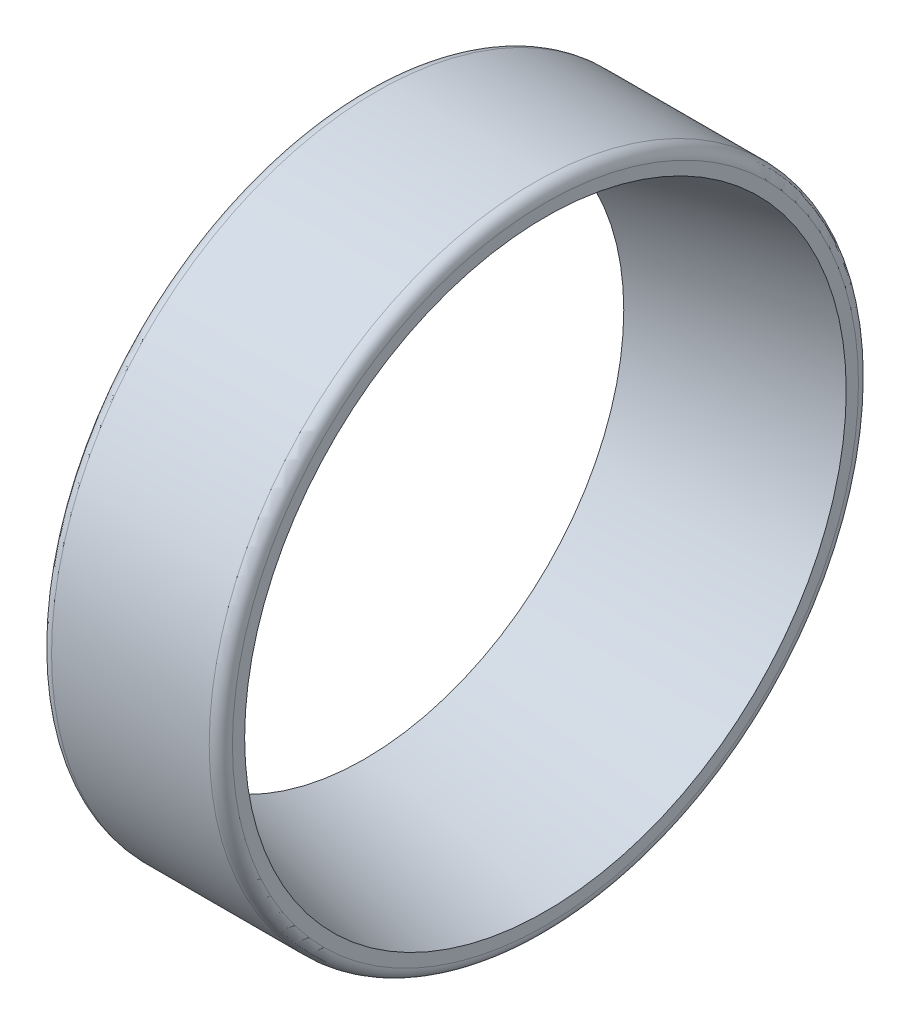
ISO-10303-21;
HEADER;
FILE_DESCRIPTION(('STEP AP214'),'2;1');
FILE_NAME('part.step','',(''),(''),'','','');
FILE_SCHEMA(('AUTOMOTIVE_DESIGN { 1 0 10303 214 1 1 1 1 }'));
ENDSEC;
DATA;
#1=APPLICATION_CONTEXT('core data for automotive mechanical design processes');
#2=APPLICATION_PROTOCOL_DEFINITION('international standard','automotive_design',2000,#1);
#3=PRODUCT_CONTEXT('',#1,'mechanical');
#4=PRODUCT('Part','Part','',(#3));
#5=PRODUCT_RELATED_PRODUCT_CATEGORY('part','',(#4));
#6=PRODUCT_DEFINITION_FORMATION('','',#4);
#7=PRODUCT_DEFINITION_CONTEXT('part definition',#1,'design');
#8=PRODUCT_DEFINITION('design','',#6,#7);
#9=PRODUCT_DEFINITION_SHAPE('','',#8);
#10=(LENGTH_UNIT() NAMED_UNIT(*) SI_UNIT(.MILLI.,.METRE.));
#11=(NAMED_UNIT(*) PLANE_ANGLE_UNIT() SI_UNIT($,.RADIAN.));
#12=(NAMED_UNIT(*) SI_UNIT($,.STERADIAN.) SOLID_ANGLE_UNIT());
#13=UNCERTAINTY_MEASURE_WITH_UNIT(LENGTH_MEASURE(1.E-05),#10,'distance_accuracy_value','');
#14=(GEOMETRIC_REPRESENTATION_CONTEXT(3) GLOBAL_UNCERTAINTY_ASSIGNED_CONTEXT((#13)) GLOBAL_UNIT_ASSIGNED_CONTEXT((#10,
#11,#12)) REPRESENTATION_CONTEXT('',''));
#15=CARTESIAN_POINT('',(0.,0.,0.));
#16=DIRECTION('',(0.,0.,1.));
#17=DIRECTION('',(1.,0.,0.));
#18=AXIS2_PLACEMENT_3D('',#15,#16,#17);
#19=CARTESIAN_POINT('',(-48.4999999999988,0.,0.));
#20=DIRECTION('',(1.,0.,0.));
#21=DIRECTION('',(0.,0.,-1.));
#22=AXIS2_PLACEMENT_3D('',#19,#20,#21);
#23=TOROIDAL_SURFACE('',#22,67.4999999999987,2.50000000000127);
#24=CARTESIAN_POINT('',(-51.,0.,0.));
#25=DIRECTION('',(1.,0.,0.));
#26=DIRECTION('',(0.,0.,-1.));
#27=AXIS2_PLACEMENT_3D('',#24,#25,#26);
#28=CIRCLE('',#27,67.500000567418);
#29=CARTESIAN_POINT('',(-51.,0.,-67.500000567418));
#30=VERTEX_POINT('',#29);
#31=EDGE_CURVE('E38',#30,#30,#28,.T.);
#32=ORIENTED_EDGE('',*,*,#31,.T.);
#33=EDGE_LOOP('',(#32));
#34=FACE_BOUND('',#33,.T.);
#35=CARTESIAN_POINT('',(-48.5,0.,0.));
#36=DIRECTION('',(1.,0.,0.));
#37=DIRECTION('',(0.,0.,-1.));
#38=AXIS2_PLACEMENT_3D('',#35,#36,#37);
#39=CIRCLE('',#38,70.);
#40=CARTESIAN_POINT('',(-48.5,0.,-70.));
#41=VERTEX_POINT('',#40);
#42=EDGE_CURVE('E35',#41,#41,#39,.T.);
#43=ORIENTED_EDGE('',*,*,#42,.F.);
#44=EDGE_LOOP('',(#43));
#45=FACE_BOUND('',#44,.T.);
#46=ADVANCED_FACE('F15',(#34,#45),#23,.T.);
#47=CARTESIAN_POINT('',(-51.,67.5,0.));
#48=DIRECTION('',(-1.,0.,0.));
#49=DIRECTION('',(0.,0.,1.));
#50=AXIS2_PLACEMENT_3D('',#47,#48,#49);
#51=PLANE('',#50);
#52=CARTESIAN_POINT('',(-51.,0.,0.));
#53=DIRECTION('',(1.,0.,0.));
#54=DIRECTION('',(0.,0.,-1.));
#55=AXIS2_PLACEMENT_3D('',#52,#53,#54);
#56=CIRCLE('',#55,55.893);
#57=CARTESIAN_POINT('',(-51.,0.,-55.893));
#58=VERTEX_POINT('',#57);
#59=EDGE_CURVE('E30',#58,#58,#56,.T.);
#60=ORIENTED_EDGE('',*,*,#59,.T.);
#61=EDGE_LOOP('',(#60));
#62=FACE_BOUND('',#61,.T.);
#63=ORIENTED_EDGE('',*,*,#31,.F.);
#64=EDGE_LOOP('',(#63));
#65=FACE_BOUND('',#64,.T.);
#66=ADVANCED_FACE('F44',(#62,#65),#51,.T.);
#67=CARTESIAN_POINT('',(-12.,0.,0.));
#68=DIRECTION('',(1.,0.,0.));
#69=DIRECTION('',(0.,0.,-1.));
#70=AXIS2_PLACEMENT_3D('',#67,#68,#69);
#71=CYLINDRICAL_SURFACE('',#70,70.);
#72=ORIENTED_EDGE('',*,*,#42,.T.);
#73=EDGE_LOOP('',(#72));
#74=FACE_BOUND('',#73,.T.);
#75=CARTESIAN_POINT('',(-14.5,0.,0.));
#76=DIRECTION('',(1.,0.,0.));
#77=DIRECTION('',(0.,0.,-1.));
#78=AXIS2_PLACEMENT_3D('',#75,#76,#77);
#79=CIRCLE('',#78,70.);
#80=CARTESIAN_POINT('',(-14.5,0.,-70.));
#81=VERTEX_POINT('',#80);
#82=EDGE_CURVE('E26',#81,#81,#79,.T.);
#83=ORIENTED_EDGE('',*,*,#82,.F.);
#84=EDGE_LOOP('',(#83));
#85=FACE_BOUND('',#84,.T.);
#86=ADVANCED_FACE('F46',(#74,#85),#71,.T.);
#87=CARTESIAN_POINT('',(-51.,0.,0.));
#88=DIRECTION('',(1.,0.,0.));
#89=DIRECTION('',(0.,0.,-1.));
#90=AXIS2_PLACEMENT_3D('',#87,#88,#89);
#91=CONICAL_SURFACE('',#90,55.893,0.226068387993882);
#92=CARTESIAN_POINT('',(-12.,0.,0.));
#93=DIRECTION('',(1.,0.,0.));
#94=DIRECTION('',(0.,0.,-1.));
#95=AXIS2_PLACEMENT_3D('',#92,#93,#94);
#96=CIRCLE('',#95,64.8629999999999);
#97=CARTESIAN_POINT('',(-12.,0.,-64.8629999999999));
#98=VERTEX_POINT('',#97);
#99=EDGE_CURVE('E22',#98,#98,#96,.T.);
#100=ORIENTED_EDGE('',*,*,#99,.T.);
#101=EDGE_LOOP('',(#100));
#102=FACE_BOUND('',#101,.T.);
#103=ORIENTED_EDGE('',*,*,#59,.F.);
#104=EDGE_LOOP('',(#103));
#105=FACE_BOUND('',#104,.T.);
#106=ADVANCED_FACE('F54',(#102,#105),#91,.F.);
#107=CARTESIAN_POINT('',(-14.5000000000013,0.,0.));
#108=DIRECTION('',(1.,0.,0.));
#109=DIRECTION('',(0.,0.,-1.));
#110=AXIS2_PLACEMENT_3D('',#107,#108,#109);
#111=TOROIDAL_SURFACE('',#110,67.4999999999987,2.50000000000126);
#112=ORIENTED_EDGE('',*,*,#82,.T.);
#113=EDGE_LOOP('',(#112));
#114=FACE_BOUND('',#113,.T.);
#115=CARTESIAN_POINT('',(-12.,0.,0.));
#116=DIRECTION('',(1.,0.,0.));
#117=DIRECTION('',(0.,0.,-1.));
#118=AXIS2_PLACEMENT_3D('',#115,#116,#117);
#119=CIRCLE('',#118,67.5000000526823);
#120=CARTESIAN_POINT('',(-12.,0.,-67.5000000526823));
#121=VERTEX_POINT('',#120);
#122=EDGE_CURVE('E10',#121,#121,#119,.T.);
#123=ORIENTED_EDGE('',*,*,#122,.F.);
#124=EDGE_LOOP('',(#123));
#125=FACE_BOUND('',#124,.T.);
#126=ADVANCED_FACE('F60',(#114,#125),#111,.T.);
#127=CARTESIAN_POINT('',(-12.,64.863,0.));
#128=DIRECTION('',(1.,0.,0.));
#129=DIRECTION('',(0.,0.,-1.));
#130=AXIS2_PLACEMENT_3D('',#127,#128,#129);
#131=PLANE('',#130);
#132=ORIENTED_EDGE('',*,*,#122,.T.);
#133=EDGE_LOOP('',(#132));
#134=FACE_BOUND('',#133,.T.);
#135=ORIENTED_EDGE('',*,*,#99,.F.);
#136=EDGE_LOOP('',(#135));
#137=FACE_BOUND('',#136,.T.);
#138=ADVANCED_FACE('F17',(#134,#137),#131,.T.);
#139=CLOSED_SHELL('',(#46,#66,#86,#106,#126,#138));
#140=MANIFOLD_SOLID_BREP('B1',#139);
#141=ADVANCED_BREP_SHAPE_REPRESENTATION('',(#18,#140),#14);
#142=SHAPE_DEFINITION_REPRESENTATION(#9,#141);
ENDSEC;
END-ISO-10303-21;
